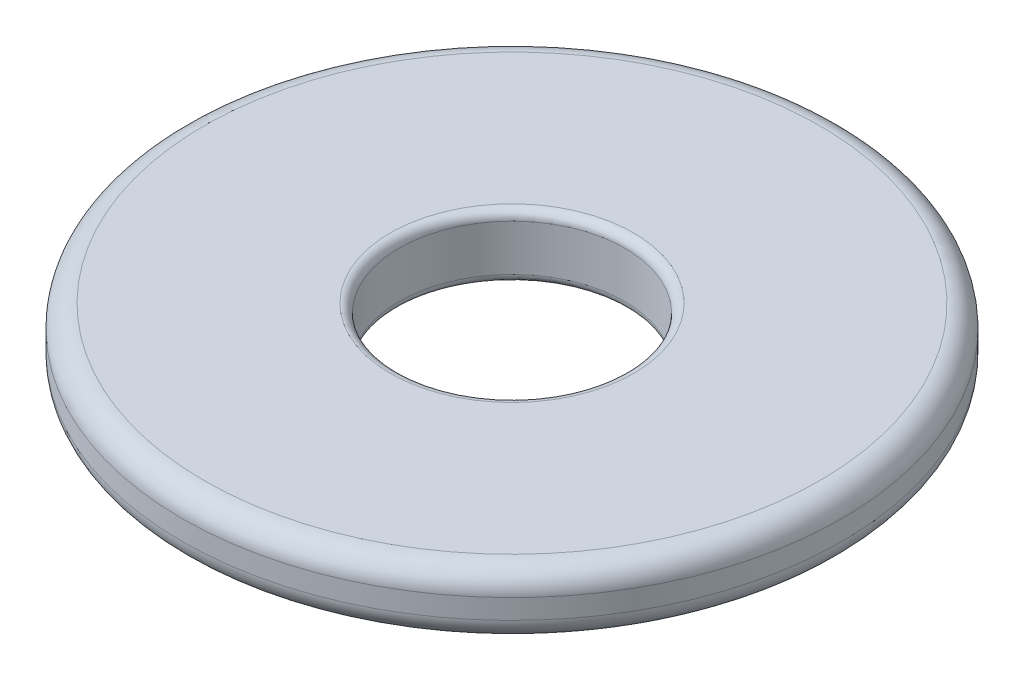
ISO-10303-21;
HEADER;
FILE_DESCRIPTION(('STEP AP214'),'2;1');
FILE_NAME('part.step','',(''),(''),'','','');
FILE_SCHEMA(('AUTOMOTIVE_DESIGN { 1 0 10303 214 1 1 1 1 }'));
ENDSEC;
DATA;
#1=APPLICATION_CONTEXT('core data for automotive mechanical design processes');
#2=APPLICATION_PROTOCOL_DEFINITION('international standard','automotive_design',2000,#1);
#3=PRODUCT_CONTEXT('',#1,'mechanical');
#4=PRODUCT('Part','Part','',(#3));
#5=PRODUCT_RELATED_PRODUCT_CATEGORY('part','',(#4));
#6=PRODUCT_DEFINITION_FORMATION('','',#4);
#7=PRODUCT_DEFINITION_CONTEXT('part definition',#1,'design');
#8=PRODUCT_DEFINITION('design','',#6,#7);
#9=PRODUCT_DEFINITION_SHAPE('','',#8);
#10=(LENGTH_UNIT() NAMED_UNIT(*) SI_UNIT(.MILLI.,.METRE.));
#11=(NAMED_UNIT(*) PLANE_ANGLE_UNIT() SI_UNIT($,.RADIAN.));
#12=(NAMED_UNIT(*) SI_UNIT($,.STERADIAN.) SOLID_ANGLE_UNIT());
#13=UNCERTAINTY_MEASURE_WITH_UNIT(LENGTH_MEASURE(1.E-05),#10,'distance_accuracy_value','');
#14=(GEOMETRIC_REPRESENTATION_CONTEXT(3) GLOBAL_UNCERTAINTY_ASSIGNED_CONTEXT((#13)) GLOBAL_UNIT_ASSIGNED_CONTEXT((#10,
#11,#12)) REPRESENTATION_CONTEXT('',''));
#15=CARTESIAN_POINT('',(0.,0.,0.));
#16=DIRECTION('',(0.,0.,1.));
#17=DIRECTION('',(1.,0.,0.));
#18=AXIS2_PLACEMENT_3D('',#15,#16,#17);
#19=CARTESIAN_POINT('',(0.,1.8415,0.));
#20=DIRECTION('',(0.,1.,0.));
#21=DIRECTION('',(0.,0.,1.));
#22=AXIS2_PLACEMENT_3D('',#19,#20,#21);
#23=PLANE('',#22);
#24=CARTESIAN_POINT('',(0.,1.8415,0.));
#25=DIRECTION('',(0.,1.,0.));
#26=DIRECTION('',(0.,0.,1.));
#27=AXIS2_PLACEMENT_3D('',#24,#25,#26);
#28=CIRCLE('',#27,3.5179);
#29=CARTESIAN_POINT('',(0.,1.8415,3.5179));
#30=VERTEX_POINT('',#29);
#31=EDGE_CURVE('E10',#30,#30,#28,.F.);
#32=ORIENTED_EDGE('',*,*,#31,.T.);
#33=EDGE_LOOP('',(#32));
#34=FACE_BOUND('',#33,.T.);
#35=CARTESIAN_POINT('',(0.,1.8415,0.));
#36=DIRECTION('',(0.,1.,0.));
#37=DIRECTION('',(0.,0.,1.));
#38=AXIS2_PLACEMENT_3D('',#35,#36,#37);
#39=CIRCLE('',#38,8.89);
#40=CARTESIAN_POINT('',(0.,1.8415,8.89));
#41=VERTEX_POINT('',#40);
#42=EDGE_CURVE('E52',#41,#41,#39,.T.);
#43=ORIENTED_EDGE('',*,*,#42,.T.);
#44=EDGE_LOOP('',(#43));
#45=FACE_BOUND('',#44,.T.);
#46=ADVANCED_FACE('F32',(#34,#45),#23,.T.);
#47=CARTESIAN_POINT('',(0.,0.,0.));
#48=DIRECTION('',(0.,1.,0.));
#49=DIRECTION('',(0.,0.,1.));
#50=AXIS2_PLACEMENT_3D('',#47,#48,#49);
#51=PLANE('',#50);
#52=CARTESIAN_POINT('',(0.,0.,0.));
#53=DIRECTION('',(0.,1.,0.));
#54=DIRECTION('',(0.,0.,1.));
#55=AXIS2_PLACEMENT_3D('',#52,#53,#54);
#56=CIRCLE('',#55,3.5179);
#57=CARTESIAN_POINT('',(0.,0.,3.5179));
#58=VERTEX_POINT('',#57);
#59=EDGE_CURVE('E47',#58,#58,#56,.T.);
#60=ORIENTED_EDGE('',*,*,#59,.T.);
#61=EDGE_LOOP('',(#60));
#62=FACE_BOUND('',#61,.T.);
#63=CARTESIAN_POINT('',(0.,0.,0.));
#64=DIRECTION('',(0.,1.,0.));
#65=DIRECTION('',(0.,0.,1.));
#66=AXIS2_PLACEMENT_3D('',#63,#64,#65);
#67=CIRCLE('',#66,8.89);
#68=CARTESIAN_POINT('',(0.,0.,8.89));
#69=VERTEX_POINT('',#68);
#70=EDGE_CURVE('E55',#69,#69,#67,.F.);
#71=ORIENTED_EDGE('',*,*,#70,.T.);
#72=EDGE_LOOP('',(#71));
#73=FACE_BOUND('',#72,.T.);
#74=ADVANCED_FACE('F76',(#62,#73),#51,.F.);
#75=CARTESIAN_POINT('',(0.,1.8415,0.));
#76=DIRECTION('',(0.,-1.,0.));
#77=DIRECTION('',(0.,0.,-1.));
#78=AXIS2_PLACEMENT_3D('',#75,#76,#77);
#79=CYLINDRICAL_SURFACE('',#78,9.525);
#80=CARTESIAN_POINT('',(0.,0.635,0.));
#81=DIRECTION('',(0.,1.,0.));
#82=DIRECTION('',(0.,0.,1.));
#83=AXIS2_PLACEMENT_3D('',#80,#81,#82);
#84=CIRCLE('',#83,9.525);
#85=CARTESIAN_POINT('',(0.,0.635,9.525));
#86=VERTEX_POINT('',#85);
#87=EDGE_CURVE('E58',#86,#86,#84,.T.);
#88=ORIENTED_EDGE('',*,*,#87,.T.);
#89=EDGE_LOOP('',(#88));
#90=FACE_BOUND('',#89,.T.);
#91=CARTESIAN_POINT('',(0.,1.2065,0.));
#92=DIRECTION('',(0.,1.,0.));
#93=DIRECTION('',(0.,0.,1.));
#94=AXIS2_PLACEMENT_3D('',#91,#92,#93);
#95=CIRCLE('',#94,9.525);
#96=CARTESIAN_POINT('',(0.,1.2065,9.525));
#97=VERTEX_POINT('',#96);
#98=EDGE_CURVE('E61',#97,#97,#95,.F.);
#99=ORIENTED_EDGE('',*,*,#98,.T.);
#100=EDGE_LOOP('',(#99));
#101=FACE_BOUND('',#100,.T.);
#102=ADVANCED_FACE('F65',(#90,#101),#79,.T.);
#103=CARTESIAN_POINT('',(0.,1.8415,0.));
#104=DIRECTION('',(0.,-1.,0.));
#105=DIRECTION('',(0.,0.,-1.));
#106=AXIS2_PLACEMENT_3D('',#103,#104,#105);
#107=CYLINDRICAL_SURFACE('',#106,3.2639);
#108=CARTESIAN_POINT('',(0.,0.254,0.));
#109=DIRECTION('',(0.,1.,0.));
#110=DIRECTION('',(0.,0.,1.));
#111=AXIS2_PLACEMENT_3D('',#108,#109,#110);
#112=CIRCLE('',#111,3.2639);
#113=CARTESIAN_POINT('',(0.,0.254,3.2639));
#114=VERTEX_POINT('',#113);
#115=EDGE_CURVE('E39',#114,#114,#112,.F.);
#116=ORIENTED_EDGE('',*,*,#115,.T.);
#117=EDGE_LOOP('',(#116));
#118=FACE_BOUND('',#117,.T.);
#119=CARTESIAN_POINT('',(0.,1.5875,0.));
#120=DIRECTION('',(0.,1.,0.));
#121=DIRECTION('',(0.,0.,1.));
#122=AXIS2_PLACEMENT_3D('',#119,#120,#121);
#123=CIRCLE('',#122,3.2639);
#124=CARTESIAN_POINT('',(0.,1.5875,3.2639));
#125=VERTEX_POINT('',#124);
#126=EDGE_CURVE('E43',#125,#125,#123,.T.);
#127=ORIENTED_EDGE('',*,*,#126,.T.);
#128=EDGE_LOOP('',(#127));
#129=FACE_BOUND('',#128,.T.);
#130=ADVANCED_FACE('F84',(#118,#129),#107,.F.);
#131=CARTESIAN_POINT('',(0.,0.635,0.));
#132=DIRECTION('',(0.,1.,0.));
#133=DIRECTION('',(0.,0.,1.));
#134=AXIS2_PLACEMENT_3D('',#131,#132,#133);
#135=TOROIDAL_SURFACE('',#134,8.89,0.635);
#136=ORIENTED_EDGE('',*,*,#70,.F.);
#137=EDGE_LOOP('',(#136));
#138=FACE_BOUND('',#137,.T.);
#139=ORIENTED_EDGE('',*,*,#87,.F.);
#140=EDGE_LOOP('',(#139));
#141=FACE_BOUND('',#140,.T.);
#142=ADVANCED_FACE('F71',(#138,#141),#135,.T.);
#143=CARTESIAN_POINT('',(0.,1.2065,0.));
#144=DIRECTION('',(0.,1.,0.));
#145=DIRECTION('',(0.,0.,1.));
#146=AXIS2_PLACEMENT_3D('',#143,#144,#145);
#147=TOROIDAL_SURFACE('',#146,8.89,0.635);
#148=ORIENTED_EDGE('',*,*,#98,.F.);
#149=EDGE_LOOP('',(#148));
#150=FACE_BOUND('',#149,.T.);
#151=ORIENTED_EDGE('',*,*,#42,.F.);
#152=EDGE_LOOP('',(#151));
#153=FACE_BOUND('',#152,.T.);
#154=ADVANCED_FACE('F67',(#150,#153),#147,.T.);
#155=CARTESIAN_POINT('',(0.,0.254,0.));
#156=DIRECTION('',(0.,1.,0.));
#157=DIRECTION('',(0.,0.,1.));
#158=AXIS2_PLACEMENT_3D('',#155,#156,#157);
#159=TOROIDAL_SURFACE('',#158,3.5179,0.254);
#160=ORIENTED_EDGE('',*,*,#115,.F.);
#161=EDGE_LOOP('',(#160));
#162=FACE_BOUND('',#161,.T.);
#163=ORIENTED_EDGE('',*,*,#59,.F.);
#164=EDGE_LOOP('',(#163));
#165=FACE_BOUND('',#164,.T.);
#166=ADVANCED_FACE('F70',(#162,#165),#159,.T.);
#167=CARTESIAN_POINT('',(0.,1.5875,0.));
#168=DIRECTION('',(0.,1.,0.));
#169=DIRECTION('',(0.,0.,1.));
#170=AXIS2_PLACEMENT_3D('',#167,#168,#169);
#171=TOROIDAL_SURFACE('',#170,3.5179,0.254);
#172=ORIENTED_EDGE('',*,*,#31,.F.);
#173=EDGE_LOOP('',(#172));
#174=FACE_BOUND('',#173,.T.);
#175=ORIENTED_EDGE('',*,*,#126,.F.);
#176=EDGE_LOOP('',(#175));
#177=FACE_BOUND('',#176,.T.);
#178=ADVANCED_FACE('F34',(#174,#177),#171,.T.);
#179=CLOSED_SHELL('',(#46,#74,#102,#130,#142,#154,#166,#178));
#180=MANIFOLD_SOLID_BREP('B2',#179);
#181=ADVANCED_BREP_SHAPE_REPRESENTATION('',(#18,#180),#14);
#182=SHAPE_DEFINITION_REPRESENTATION(#9,#181);
ENDSEC;
END-ISO-10303-21;
